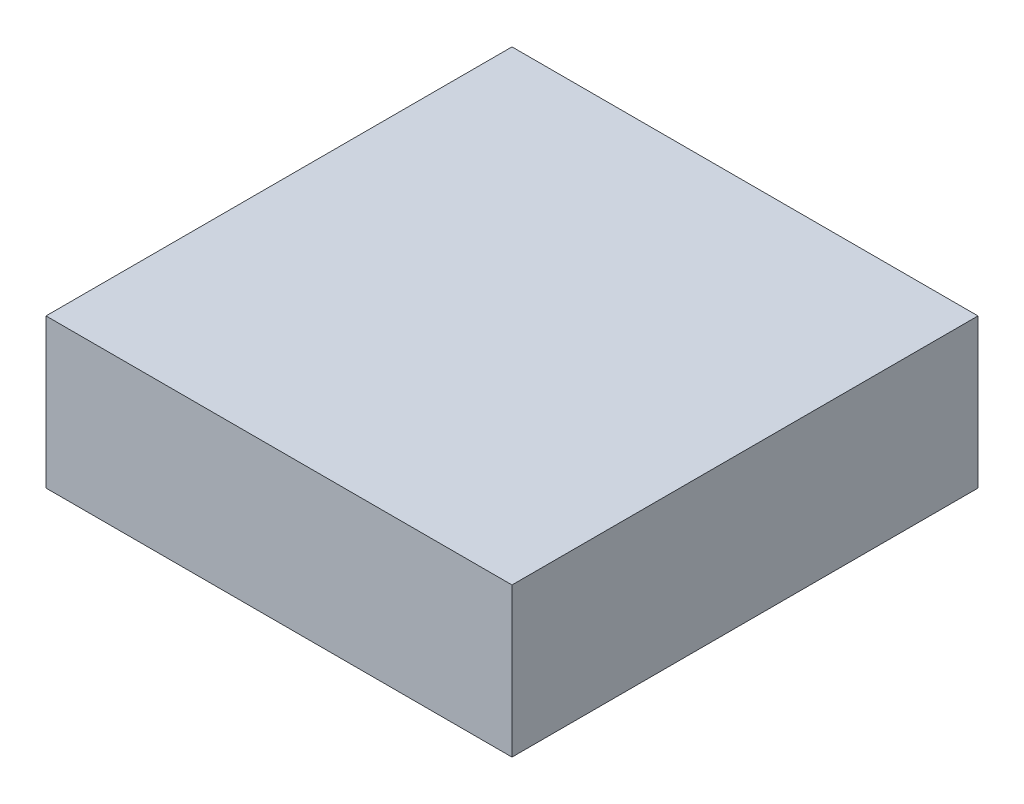
ISO-10303-21;
HEADER;
FILE_DESCRIPTION(('STEP AP214'),'2;1');
FILE_NAME('part.step','',(''),(''),'','','');
FILE_SCHEMA(('AUTOMOTIVE_DESIGN { 1 0 10303 214 1 1 1 1 }'));
ENDSEC;
DATA;
#1=APPLICATION_CONTEXT('core data for automotive mechanical design processes');
#2=APPLICATION_PROTOCOL_DEFINITION('international standard','automotive_design',2000,#1);
#3=PRODUCT_CONTEXT('',#1,'mechanical');
#4=PRODUCT('Part','Part','',(#3));
#5=PRODUCT_RELATED_PRODUCT_CATEGORY('part','',(#4));
#6=PRODUCT_DEFINITION_FORMATION('','',#4);
#7=PRODUCT_DEFINITION_CONTEXT('part definition',#1,'design');
#8=PRODUCT_DEFINITION('design','',#6,#7);
#9=PRODUCT_DEFINITION_SHAPE('','',#8);
#10=(LENGTH_UNIT() NAMED_UNIT(*) SI_UNIT(.MILLI.,.METRE.));
#11=(NAMED_UNIT(*) PLANE_ANGLE_UNIT() SI_UNIT($,.RADIAN.));
#12=(NAMED_UNIT(*) SI_UNIT($,.STERADIAN.) SOLID_ANGLE_UNIT());
#13=UNCERTAINTY_MEASURE_WITH_UNIT(LENGTH_MEASURE(1.E-05),#10,'distance_accuracy_value','');
#14=(GEOMETRIC_REPRESENTATION_CONTEXT(3) GLOBAL_UNCERTAINTY_ASSIGNED_CONTEXT((#13)) GLOBAL_UNIT_ASSIGNED_CONTEXT((#10,
#11,#12)) REPRESENTATION_CONTEXT('',''));
#15=CARTESIAN_POINT('',(0.,0.,0.));
#16=DIRECTION('',(0.,0.,1.));
#17=DIRECTION('',(1.,0.,0.));
#18=AXIS2_PLACEMENT_3D('',#15,#16,#17);
#19=CARTESIAN_POINT('',(6.35,4.064,6.35));
#20=DIRECTION('',(-1.,0.,0.));
#21=DIRECTION('',(0.,0.,1.));
#22=AXIS2_PLACEMENT_3D('',#19,#20,#21);
#23=PLANE('',#22);
#24=DIRECTION('',(0.,0.,-1.));
#25=VECTOR('',#24,1.);
#26=CARTESIAN_POINT('',(6.35,0.,6.35));
#27=LINE('',#26,#25);
#28=CARTESIAN_POINT('',(6.35,0.,6.35));
#29=VERTEX_POINT('',#28);
#30=CARTESIAN_POINT('',(6.35,0.,-6.35));
#31=VERTEX_POINT('',#30);
#32=EDGE_CURVE('E99',#29,#31,#27,.T.);
#33=ORIENTED_EDGE('',*,*,#32,.T.);
#34=DIRECTION('',(0.,-1.,0.));
#35=VECTOR('',#34,1.);
#36=CARTESIAN_POINT('',(6.35,4.064,-6.35));
#37=LINE('',#36,#35);
#38=CARTESIAN_POINT('',(6.35,4.064,-6.35));
#39=VERTEX_POINT('',#38);
#40=EDGE_CURVE('E11',#39,#31,#37,.T.);
#41=ORIENTED_EDGE('',*,*,#40,.F.);
#42=DIRECTION('',(0.,0.,-1.));
#43=VECTOR('',#42,1.);
#44=CARTESIAN_POINT('',(6.35,4.064,6.35));
#45=LINE('',#44,#43);
#46=CARTESIAN_POINT('',(6.35,4.064,6.35));
#47=VERTEX_POINT('',#46);
#48=EDGE_CURVE('E87',#47,#39,#45,.T.);
#49=ORIENTED_EDGE('',*,*,#48,.F.);
#50=DIRECTION('',(0.,-1.,0.));
#51=VECTOR('',#50,1.);
#52=CARTESIAN_POINT('',(6.35,4.064,6.35));
#53=LINE('',#52,#51);
#54=EDGE_CURVE('E95',#47,#29,#53,.T.);
#55=ORIENTED_EDGE('',*,*,#54,.T.);
#56=EDGE_LOOP('',(#33,#41,#49,#55));
#57=FACE_BOUND('',#56,.T.);
#58=ADVANCED_FACE('F36',(#57),#23,.F.);
#59=CARTESIAN_POINT('',(-6.35,4.064,-6.35));
#60=DIRECTION('',(0.,0.,1.));
#61=DIRECTION('',(1.,0.,0.));
#62=AXIS2_PLACEMENT_3D('',#59,#60,#61);
#63=PLANE('',#62);
#64=DIRECTION('',(-1.,0.,0.));
#65=VECTOR('',#64,1.);
#66=CARTESIAN_POINT('',(-6.35,0.,-6.35));
#67=LINE('',#66,#65);
#68=CARTESIAN_POINT('',(-6.35,0.,-6.35));
#69=VERTEX_POINT('',#68);
#70=EDGE_CURVE('E91',#31,#69,#67,.T.);
#71=ORIENTED_EDGE('',*,*,#70,.T.);
#72=DIRECTION('',(0.,-1.,0.));
#73=VECTOR('',#72,1.);
#74=CARTESIAN_POINT('',(-6.35,4.064,-6.35));
#75=LINE('',#74,#73);
#76=CARTESIAN_POINT('',(-6.35,4.064,-6.35));
#77=VERTEX_POINT('',#76);
#78=EDGE_CURVE('E44',#77,#69,#75,.T.);
#79=ORIENTED_EDGE('',*,*,#78,.F.);
#80=DIRECTION('',(-1.,0.,0.));
#81=VECTOR('',#80,1.);
#82=CARTESIAN_POINT('',(-6.35,4.064,-6.35));
#83=LINE('',#82,#81);
#84=EDGE_CURVE('E82',#39,#77,#83,.T.);
#85=ORIENTED_EDGE('',*,*,#84,.F.);
#86=ORIENTED_EDGE('',*,*,#40,.T.);
#87=EDGE_LOOP('',(#71,#79,#85,#86));
#88=FACE_BOUND('',#87,.T.);
#89=ADVANCED_FACE('F90',(#88),#63,.F.);
#90=CARTESIAN_POINT('',(-6.35,4.064,6.35));
#91=DIRECTION('',(1.,0.,0.));
#92=DIRECTION('',(0.,0.,-1.));
#93=AXIS2_PLACEMENT_3D('',#90,#91,#92);
#94=PLANE('',#93);
#95=DIRECTION('',(0.,0.,1.));
#96=VECTOR('',#95,1.);
#97=CARTESIAN_POINT('',(-6.35,0.,6.35));
#98=LINE('',#97,#96);
#99=CARTESIAN_POINT('',(-6.35,0.,6.35));
#100=VERTEX_POINT('',#99);
#101=EDGE_CURVE('E69',#69,#100,#98,.T.);
#102=ORIENTED_EDGE('',*,*,#101,.T.);
#103=DIRECTION('',(0.,-1.,0.));
#104=VECTOR('',#103,1.);
#105=CARTESIAN_POINT('',(-6.35,4.064,6.35));
#106=LINE('',#105,#104);
#107=CARTESIAN_POINT('',(-6.35,4.064,6.35));
#108=VERTEX_POINT('',#107);
#109=EDGE_CURVE('E92',#108,#100,#106,.T.);
#110=ORIENTED_EDGE('',*,*,#109,.F.);
#111=DIRECTION('',(0.,0.,1.));
#112=VECTOR('',#111,1.);
#113=CARTESIAN_POINT('',(-6.35,4.064,6.35));
#114=LINE('',#113,#112);
#115=EDGE_CURVE('E85',#77,#108,#114,.T.);
#116=ORIENTED_EDGE('',*,*,#115,.F.);
#117=ORIENTED_EDGE('',*,*,#78,.T.);
#118=EDGE_LOOP('',(#102,#110,#116,#117));
#119=FACE_BOUND('',#118,.T.);
#120=ADVANCED_FACE('F93',(#119),#94,.F.);
#121=CARTESIAN_POINT('',(-6.35,4.064,6.35));
#122=DIRECTION('',(0.,0.,-1.));
#123=DIRECTION('',(-1.,0.,0.));
#124=AXIS2_PLACEMENT_3D('',#121,#122,#123);
#125=PLANE('',#124);
#126=DIRECTION('',(1.,0.,0.));
#127=VECTOR('',#126,1.);
#128=CARTESIAN_POINT('',(-6.35,0.,6.35));
#129=LINE('',#128,#127);
#130=EDGE_CURVE('E75',#100,#29,#129,.T.);
#131=ORIENTED_EDGE('',*,*,#130,.T.);
#132=ORIENTED_EDGE('',*,*,#54,.F.);
#133=DIRECTION('',(1.,0.,0.));
#134=VECTOR('',#133,1.);
#135=CARTESIAN_POINT('',(-6.35,4.064,6.35));
#136=LINE('',#135,#134);
#137=EDGE_CURVE('E52',#108,#47,#136,.T.);
#138=ORIENTED_EDGE('',*,*,#137,.F.);
#139=ORIENTED_EDGE('',*,*,#109,.T.);
#140=EDGE_LOOP('',(#131,#132,#138,#139));
#141=FACE_BOUND('',#140,.T.);
#142=ADVANCED_FACE('F106',(#141),#125,.F.);
#143=CARTESIAN_POINT('',(0.,4.064,0.));
#144=DIRECTION('',(0.,-1.,0.));
#145=DIRECTION('',(0.,0.,-1.));
#146=AXIS2_PLACEMENT_3D('',#143,#144,#145);
#147=PLANE('',#146);
#148=ORIENTED_EDGE('',*,*,#48,.T.);
#149=ORIENTED_EDGE('',*,*,#84,.T.);
#150=ORIENTED_EDGE('',*,*,#115,.T.);
#151=ORIENTED_EDGE('',*,*,#137,.T.);
#152=EDGE_LOOP('',(#148,#149,#150,#151));
#153=FACE_BOUND('',#152,.T.);
#154=ADVANCED_FACE('F83',(#153),#147,.F.);
#155=CARTESIAN_POINT('',(0.,0.,0.));
#156=DIRECTION('',(0.,-1.,0.));
#157=DIRECTION('',(0.,0.,-1.));
#158=AXIS2_PLACEMENT_3D('',#155,#156,#157);
#159=PLANE('',#158);
#160=ORIENTED_EDGE('',*,*,#32,.F.);
#161=ORIENTED_EDGE('',*,*,#130,.F.);
#162=ORIENTED_EDGE('',*,*,#101,.F.);
#163=ORIENTED_EDGE('',*,*,#70,.F.);
#164=EDGE_LOOP('',(#160,#161,#162,#163));
#165=FACE_BOUND('',#164,.T.);
#166=ADVANCED_FACE('F109',(#165),#159,.T.);
#167=CLOSED_SHELL('',(#58,#89,#120,#142,#154,#166));
#168=MANIFOLD_SOLID_BREP('B2',#167);
#169=ADVANCED_BREP_SHAPE_REPRESENTATION('',(#18,#168),#14);
#170=SHAPE_DEFINITION_REPRESENTATION(#9,#169);
ENDSEC;
END-ISO-10303-21;
